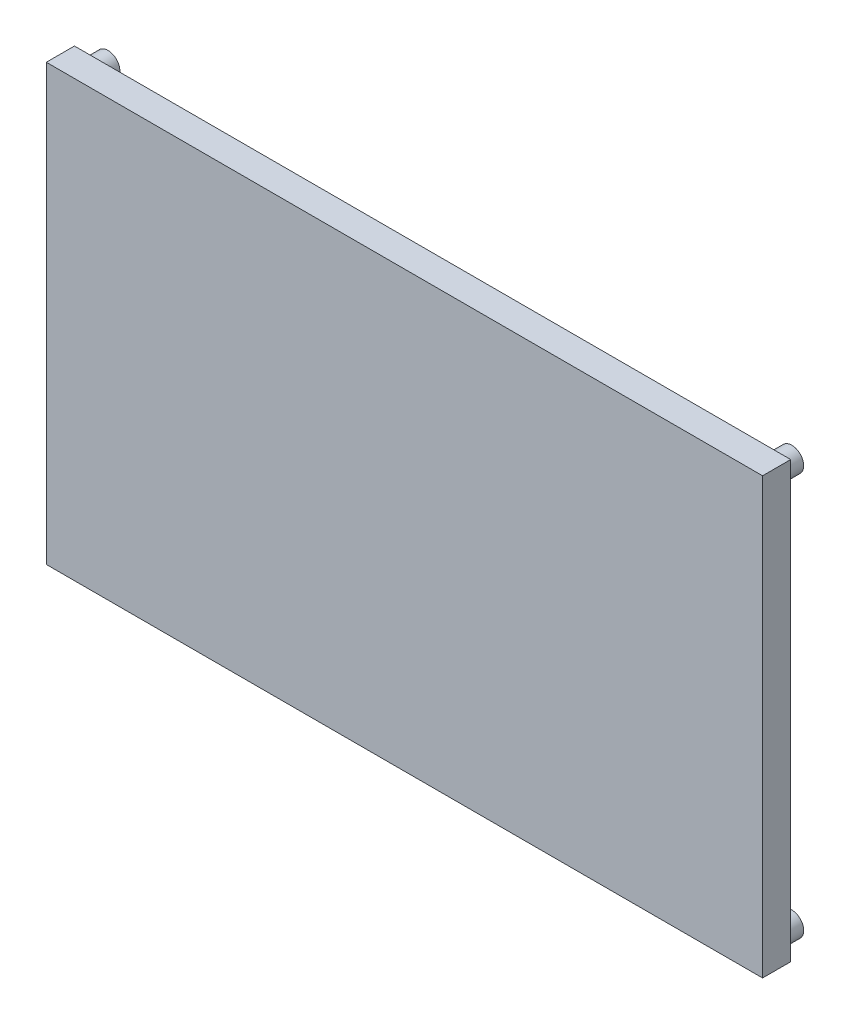
ISO-10303-21;
HEADER;
FILE_DESCRIPTION(('STEP AP214'),'2;1');
FILE_NAME('part.step','',(''),(''),'','','');
FILE_SCHEMA(('AUTOMOTIVE_DESIGN { 1 0 10303 214 1 1 1 1 }'));
ENDSEC;
DATA;
#1=APPLICATION_CONTEXT('core data for automotive mechanical design processes');
#2=APPLICATION_PROTOCOL_DEFINITION('international standard','automotive_design',2000,#1);
#3=PRODUCT_CONTEXT('',#1,'mechanical');
#4=PRODUCT('Part','Part','',(#3));
#5=PRODUCT_RELATED_PRODUCT_CATEGORY('part','',(#4));
#6=PRODUCT_DEFINITION_FORMATION('','',#4);
#7=PRODUCT_DEFINITION_CONTEXT('part definition',#1,'design');
#8=PRODUCT_DEFINITION('design','',#6,#7);
#9=PRODUCT_DEFINITION_SHAPE('','',#8);
#10=(LENGTH_UNIT() NAMED_UNIT(*) SI_UNIT(.MILLI.,.METRE.));
#11=(NAMED_UNIT(*) PLANE_ANGLE_UNIT() SI_UNIT($,.RADIAN.));
#12=(NAMED_UNIT(*) SI_UNIT($,.STERADIAN.) SOLID_ANGLE_UNIT());
#13=UNCERTAINTY_MEASURE_WITH_UNIT(LENGTH_MEASURE(1.E-05),#10,'distance_accuracy_value','');
#14=(GEOMETRIC_REPRESENTATION_CONTEXT(3) GLOBAL_UNCERTAINTY_ASSIGNED_CONTEXT((#13)) GLOBAL_UNIT_ASSIGNED_CONTEXT((#10,
#11,#12)) REPRESENTATION_CONTEXT('',''));
#15=CARTESIAN_POINT('',(0.,0.,0.));
#16=DIRECTION('',(0.,0.,1.));
#17=DIRECTION('',(1.,0.,0.));
#18=AXIS2_PLACEMENT_3D('',#15,#16,#17);
#19=CARTESIAN_POINT('',(82.75,-50.25,3.25));
#20=DIRECTION('',(-1.,0.,0.));
#21=DIRECTION('',(0.,-1.,0.));
#22=AXIS2_PLACEMENT_3D('',#19,#20,#21);
#23=PLANE('',#22);
#24=DIRECTION('',(0.,1.,0.));
#25=VECTOR('',#24,1.);
#26=CARTESIAN_POINT('',(82.75,-50.25,-3.25));
#27=LINE('',#26,#25);
#28=CARTESIAN_POINT('',(82.75,-50.25,-3.25));
#29=VERTEX_POINT('',#28);
#30=CARTESIAN_POINT('',(82.75,50.25,-3.25));
#31=VERTEX_POINT('',#30);
#32=EDGE_CURVE('E116',#29,#31,#27,.T.);
#33=ORIENTED_EDGE('',*,*,#32,.T.);
#34=DIRECTION('',(0.,0.,-1.));
#35=VECTOR('',#34,1.);
#36=CARTESIAN_POINT('',(82.75,50.25,3.25));
#37=LINE('',#36,#35);
#38=CARTESIAN_POINT('',(82.75,50.25,3.25));
#39=VERTEX_POINT('',#38);
#40=EDGE_CURVE('E105',#39,#31,#37,.T.);
#41=ORIENTED_EDGE('',*,*,#40,.F.);
#42=DIRECTION('',(0.,1.,0.));
#43=VECTOR('',#42,1.);
#44=CARTESIAN_POINT('',(82.75,-50.25,3.25));
#45=LINE('',#44,#43);
#46=CARTESIAN_POINT('',(82.75,-50.25,3.25));
#47=VERTEX_POINT('',#46);
#48=EDGE_CURVE('E97',#47,#39,#45,.T.);
#49=ORIENTED_EDGE('',*,*,#48,.F.);
#50=DIRECTION('',(0.,0.,-1.));
#51=VECTOR('',#50,1.);
#52=CARTESIAN_POINT('',(82.75,-50.25,3.25));
#53=LINE('',#52,#51);
#54=EDGE_CURVE('E112',#47,#29,#53,.T.);
#55=ORIENTED_EDGE('',*,*,#54,.T.);
#56=EDGE_LOOP('',(#33,#41,#49,#55));
#57=FACE_BOUND('',#56,.T.);
#58=ADVANCED_FACE('F44',(#57),#23,.F.);
#59=CARTESIAN_POINT('',(-82.75,50.25,3.25));
#60=DIRECTION('',(0.,-1.,0.));
#61=DIRECTION('',(0.,0.,-1.));
#62=AXIS2_PLACEMENT_3D('',#59,#60,#61);
#63=PLANE('',#62);
#64=DIRECTION('',(-1.,0.,0.));
#65=VECTOR('',#64,1.);
#66=CARTESIAN_POINT('',(-82.75,50.25,-3.25));
#67=LINE('',#66,#65);
#68=CARTESIAN_POINT('',(-82.75,50.25,-3.25));
#69=VERTEX_POINT('',#68);
#70=EDGE_CURVE('E103',#31,#69,#67,.T.);
#71=ORIENTED_EDGE('',*,*,#70,.T.);
#72=DIRECTION('',(0.,0.,-1.));
#73=VECTOR('',#72,1.);
#74=CARTESIAN_POINT('',(-82.75,50.25,3.25));
#75=LINE('',#74,#73);
#76=CARTESIAN_POINT('',(-82.75,50.25,3.25));
#77=VERTEX_POINT('',#76);
#78=EDGE_CURVE('E101',#77,#69,#75,.T.);
#79=ORIENTED_EDGE('',*,*,#78,.F.);
#80=DIRECTION('',(-1.,0.,0.));
#81=VECTOR('',#80,1.);
#82=CARTESIAN_POINT('',(-82.75,50.25,3.25));
#83=LINE('',#82,#81);
#84=EDGE_CURVE('E92',#39,#77,#83,.T.);
#85=ORIENTED_EDGE('',*,*,#84,.F.);
#86=ORIENTED_EDGE('',*,*,#40,.T.);
#87=EDGE_LOOP('',(#71,#79,#85,#86));
#88=FACE_BOUND('',#87,.T.);
#89=ADVANCED_FACE('F102',(#88),#63,.F.);
#90=CARTESIAN_POINT('',(-82.75,-50.25,3.25));
#91=DIRECTION('',(1.,0.,0.));
#92=DIRECTION('',(0.,0.,-1.));
#93=AXIS2_PLACEMENT_3D('',#90,#91,#92);
#94=PLANE('',#93);
#95=DIRECTION('',(0.,-1.,0.));
#96=VECTOR('',#95,1.);
#97=CARTESIAN_POINT('',(-82.75,-50.25,-3.25));
#98=LINE('',#97,#96);
#99=CARTESIAN_POINT('',(-82.75,-50.25,-3.25));
#100=VERTEX_POINT('',#99);
#101=EDGE_CURVE('E78',#69,#100,#98,.T.);
#102=ORIENTED_EDGE('',*,*,#101,.T.);
#103=DIRECTION('',(0.,0.,-1.));
#104=VECTOR('',#103,1.);
#105=CARTESIAN_POINT('',(-82.75,-50.25,3.25));
#106=LINE('',#105,#104);
#107=CARTESIAN_POINT('',(-82.75,-50.25,3.25));
#108=VERTEX_POINT('',#107);
#109=EDGE_CURVE('E106',#108,#100,#106,.T.);
#110=ORIENTED_EDGE('',*,*,#109,.F.);
#111=DIRECTION('',(0.,-1.,0.));
#112=VECTOR('',#111,1.);
#113=CARTESIAN_POINT('',(-82.75,-50.25,3.25));
#114=LINE('',#113,#112);
#115=EDGE_CURVE('E95',#77,#108,#114,.T.);
#116=ORIENTED_EDGE('',*,*,#115,.F.);
#117=ORIENTED_EDGE('',*,*,#78,.T.);
#118=EDGE_LOOP('',(#102,#110,#116,#117));
#119=FACE_BOUND('',#118,.T.);
#120=ADVANCED_FACE('F108',(#119),#94,.F.);
#121=CARTESIAN_POINT('',(-82.75,-50.25,3.25));
#122=DIRECTION('',(0.,1.,0.));
#123=DIRECTION('',(-1.,0.,0.));
#124=AXIS2_PLACEMENT_3D('',#121,#122,#123);
#125=PLANE('',#124);
#126=DIRECTION('',(1.,0.,0.));
#127=VECTOR('',#126,1.);
#128=CARTESIAN_POINT('',(-82.75,-50.25,-3.25));
#129=LINE('',#128,#127);
#130=EDGE_CURVE('E84',#100,#29,#129,.T.);
#131=ORIENTED_EDGE('',*,*,#130,.T.);
#132=ORIENTED_EDGE('',*,*,#54,.F.);
#133=DIRECTION('',(1.,0.,0.));
#134=VECTOR('',#133,1.);
#135=CARTESIAN_POINT('',(-82.75,-50.25,3.25));
#136=LINE('',#135,#134);
#137=EDGE_CURVE('E61',#108,#47,#136,.T.);
#138=ORIENTED_EDGE('',*,*,#137,.F.);
#139=ORIENTED_EDGE('',*,*,#109,.T.);
#140=EDGE_LOOP('',(#131,#132,#138,#139));
#141=FACE_BOUND('',#140,.T.);
#142=ADVANCED_FACE('F150',(#141),#125,.F.);
#143=CARTESIAN_POINT('',(0.,0.,3.25));
#144=DIRECTION('',(0.,0.,-1.));
#145=DIRECTION('',(-1.,0.,0.));
#146=AXIS2_PLACEMENT_3D('',#143,#144,#145);
#147=PLANE('',#146);
#148=ORIENTED_EDGE('',*,*,#48,.T.);
#149=ORIENTED_EDGE('',*,*,#84,.T.);
#150=ORIENTED_EDGE('',*,*,#115,.T.);
#151=ORIENTED_EDGE('',*,*,#137,.T.);
#152=EDGE_LOOP('',(#148,#149,#150,#151));
#153=FACE_BOUND('',#152,.T.);
#154=ADVANCED_FACE('F93',(#153),#147,.F.);
#155=CARTESIAN_POINT('',(0.,0.,-3.25));
#156=DIRECTION('',(0.,0.,-1.));
#157=DIRECTION('',(-1.,0.,0.));
#158=AXIS2_PLACEMENT_3D('',#155,#156,#157);
#159=PLANE('',#158);
#160=CARTESIAN_POINT('',(79.,-46.5,-3.25));
#161=DIRECTION('',(0.,0.,-1.));
#162=DIRECTION('',(1.,0.,0.));
#163=AXIS2_PLACEMENT_3D('',#160,#161,#162);
#164=CIRCLE('',#163,2.75000000000001);
#165=CARTESIAN_POINT('',(81.75,-46.5,-3.25));
#166=VERTEX_POINT('',#165);
#167=EDGE_CURVE('E273',#166,#166,#164,.T.);
#168=ORIENTED_EDGE('',*,*,#167,.F.);
#169=EDGE_LOOP('',(#168));
#170=FACE_BOUND('',#169,.T.);
#171=CARTESIAN_POINT('',(-79.,-46.5,-3.25));
#172=DIRECTION('',(0.,0.,-1.));
#173=DIRECTION('',(-1.,0.,0.));
#174=AXIS2_PLACEMENT_3D('',#171,#172,#173);
#175=CIRCLE('',#174,2.75000000000001);
#176=CARTESIAN_POINT('',(-81.75,-46.5,-3.25));
#177=VERTEX_POINT('',#176);
#178=EDGE_CURVE('E11',#177,#177,#175,.T.);
#179=ORIENTED_EDGE('',*,*,#178,.F.);
#180=EDGE_LOOP('',(#179));
#181=FACE_BOUND('',#180,.T.);
#182=CARTESIAN_POINT('',(79.,46.5,-3.25));
#183=DIRECTION('',(0.,0.,-1.));
#184=DIRECTION('',(-1.,0.,0.));
#185=AXIS2_PLACEMENT_3D('',#182,#183,#184);
#186=CIRCLE('',#185,2.75000000000001);
#187=CARTESIAN_POINT('',(76.25,46.5,-3.25));
#188=VERTEX_POINT('',#187);
#189=EDGE_CURVE('E53',#188,#188,#186,.T.);
#190=ORIENTED_EDGE('',*,*,#189,.F.);
#191=EDGE_LOOP('',(#190));
#192=FACE_BOUND('',#191,.T.);
#193=CARTESIAN_POINT('',(-79.,46.5,-3.25));
#194=DIRECTION('',(0.,0.,-1.));
#195=DIRECTION('',(-1.,0.,0.));
#196=AXIS2_PLACEMENT_3D('',#193,#194,#195);
#197=CIRCLE('',#196,2.75000000000001);
#198=CARTESIAN_POINT('',(-81.75,46.5,-3.25));
#199=VERTEX_POINT('',#198);
#200=EDGE_CURVE('E147',#199,#199,#197,.T.);
#201=ORIENTED_EDGE('',*,*,#200,.F.);
#202=EDGE_LOOP('',(#201));
#203=FACE_BOUND('',#202,.T.);
#204=ORIENTED_EDGE('',*,*,#32,.F.);
#205=ORIENTED_EDGE('',*,*,#130,.F.);
#206=ORIENTED_EDGE('',*,*,#101,.F.);
#207=ORIENTED_EDGE('',*,*,#70,.F.);
#208=EDGE_LOOP('',(#204,#205,#206,#207));
#209=FACE_BOUND('',#208,.T.);
#210=ADVANCED_FACE('F138',(#170,#181,#192,#203,#209),#159,.T.);
#211=CARTESIAN_POINT('',(-79.,46.5,-7.25));
#212=DIRECTION('',(0.,0.,1.));
#213=DIRECTION('',(1.,0.,0.));
#214=AXIS2_PLACEMENT_3D('',#211,#212,#213);
#215=CYLINDRICAL_SURFACE('',#214,2.75000000000001);
#216=CARTESIAN_POINT('',(-79.,46.5,-7.25));
#217=DIRECTION('',(0.,0.,-1.));
#218=DIRECTION('',(-1.,0.,0.));
#219=AXIS2_PLACEMENT_3D('',#216,#217,#218);
#220=CIRCLE('',#219,2.75000000000001);
#221=CARTESIAN_POINT('',(-81.75,46.5,-7.25));
#222=VERTEX_POINT('',#221);
#223=EDGE_CURVE('E120',#222,#222,#220,.T.);
#224=ORIENTED_EDGE('',*,*,#223,.F.);
#225=EDGE_LOOP('',(#224));
#226=FACE_BOUND('',#225,.T.);
#227=ORIENTED_EDGE('',*,*,#200,.T.);
#228=EDGE_LOOP('',(#227));
#229=FACE_BOUND('',#228,.T.);
#230=ADVANCED_FACE('F141',(#226,#229),#215,.T.);
#231=CARTESIAN_POINT('',(-79.,46.5,-7.25));
#232=DIRECTION('',(0.,0.,-1.));
#233=DIRECTION('',(-1.,0.,0.));
#234=AXIS2_PLACEMENT_3D('',#231,#232,#233);
#235=PLANE('',#234);
#236=ORIENTED_EDGE('',*,*,#223,.T.);
#237=EDGE_LOOP('',(#236));
#238=FACE_BOUND('',#237,.T.);
#239=ADVANCED_FACE('F198',(#238),#235,.T.);
#240=CARTESIAN_POINT('',(79.,46.5,-7.25));
#241=DIRECTION('',(0.,0.,1.));
#242=DIRECTION('',(1.,0.,0.));
#243=AXIS2_PLACEMENT_3D('',#240,#241,#242);
#244=CYLINDRICAL_SURFACE('',#243,2.75000000000001);
#245=CARTESIAN_POINT('',(79.,46.5,-7.25));
#246=DIRECTION('',(0.,0.,1.));
#247=DIRECTION('',(1.,0.,0.));
#248=AXIS2_PLACEMENT_3D('',#245,#246,#247);
#249=CIRCLE('',#248,2.75000000000001);
#250=CARTESIAN_POINT('',(81.75,46.5,-7.25));
#251=VERTEX_POINT('',#250);
#252=EDGE_CURVE('E278',#251,#251,#249,.T.);
#253=ORIENTED_EDGE('',*,*,#252,.T.);
#254=EDGE_LOOP('',(#253));
#255=FACE_BOUND('',#254,.T.);
#256=ORIENTED_EDGE('',*,*,#189,.T.);
#257=EDGE_LOOP('',(#256));
#258=FACE_BOUND('',#257,.T.);
#259=ADVANCED_FACE('F136',(#255,#258),#244,.T.);
#260=CARTESIAN_POINT('',(79.,46.5,-7.25));
#261=DIRECTION('',(0.,0.,-1.));
#262=DIRECTION('',(1.,0.,0.));
#263=AXIS2_PLACEMENT_3D('',#260,#261,#262);
#264=PLANE('',#263);
#265=ORIENTED_EDGE('',*,*,#252,.F.);
#266=EDGE_LOOP('',(#265));
#267=FACE_BOUND('',#266,.T.);
#268=ADVANCED_FACE('F215',(#267),#264,.T.);
#269=CARTESIAN_POINT('',(-79.,-46.5,-7.25));
#270=DIRECTION('',(0.,0.,1.));
#271=DIRECTION('',(1.,0.,0.));
#272=AXIS2_PLACEMENT_3D('',#269,#270,#271);
#273=CYLINDRICAL_SURFACE('',#272,2.75000000000001);
#274=CARTESIAN_POINT('',(-79.,-46.5,-7.25));
#275=DIRECTION('',(0.,0.,1.));
#276=DIRECTION('',(-1.,0.,0.));
#277=AXIS2_PLACEMENT_3D('',#274,#275,#276);
#278=CIRCLE('',#277,2.75000000000001);
#279=CARTESIAN_POINT('',(-81.75,-46.5,-7.25));
#280=VERTEX_POINT('',#279);
#281=EDGE_CURVE('E272',#280,#280,#278,.T.);
#282=ORIENTED_EDGE('',*,*,#281,.T.);
#283=EDGE_LOOP('',(#282));
#284=FACE_BOUND('',#283,.T.);
#285=ORIENTED_EDGE('',*,*,#178,.T.);
#286=EDGE_LOOP('',(#285));
#287=FACE_BOUND('',#286,.T.);
#288=ADVANCED_FACE('F225',(#284,#287),#273,.T.);
#289=CARTESIAN_POINT('',(-79.,-46.5,-7.25));
#290=DIRECTION('',(0.,0.,-1.));
#291=DIRECTION('',(-1.,0.,0.));
#292=AXIS2_PLACEMENT_3D('',#289,#290,#291);
#293=PLANE('',#292);
#294=ORIENTED_EDGE('',*,*,#281,.F.);
#295=EDGE_LOOP('',(#294));
#296=FACE_BOUND('',#295,.T.);
#297=ADVANCED_FACE('F235',(#296),#293,.T.);
#298=CARTESIAN_POINT('',(79.,-46.5,-7.25));
#299=DIRECTION('',(0.,0.,1.));
#300=DIRECTION('',(1.,0.,0.));
#301=AXIS2_PLACEMENT_3D('',#298,#299,#300);
#302=CYLINDRICAL_SURFACE('',#301,2.75000000000001);
#303=CARTESIAN_POINT('',(79.,-46.5,-7.25));
#304=DIRECTION('',(0.,0.,-1.));
#305=DIRECTION('',(1.,0.,0.));
#306=AXIS2_PLACEMENT_3D('',#303,#304,#305);
#307=CIRCLE('',#306,2.75000000000001);
#308=CARTESIAN_POINT('',(81.75,-46.5,-7.25));
#309=VERTEX_POINT('',#308);
#310=EDGE_CURVE('E270',#309,#309,#307,.T.);
#311=ORIENTED_EDGE('',*,*,#310,.F.);
#312=EDGE_LOOP('',(#311));
#313=FACE_BOUND('',#312,.T.);
#314=ORIENTED_EDGE('',*,*,#167,.T.);
#315=EDGE_LOOP('',(#314));
#316=FACE_BOUND('',#315,.T.);
#317=ADVANCED_FACE('F245',(#313,#316),#302,.T.);
#318=CARTESIAN_POINT('',(79.,-46.5,-7.25));
#319=DIRECTION('',(0.,0.,-1.));
#320=DIRECTION('',(1.,0.,0.));
#321=AXIS2_PLACEMENT_3D('',#318,#319,#320);
#322=PLANE('',#321);
#323=ORIENTED_EDGE('',*,*,#310,.T.);
#324=EDGE_LOOP('',(#323));
#325=FACE_BOUND('',#324,.T.);
#326=ADVANCED_FACE('F255',(#325),#322,.T.);
#327=CLOSED_SHELL('',(#58,#89,#120,#142,#154,#210,#230,#239,#259,#268,#288,#297,#317,#326));
#328=MANIFOLD_SOLID_BREP('B2',#327);
#329=ADVANCED_BREP_SHAPE_REPRESENTATION('',(#18,#328),#14);
#330=SHAPE_DEFINITION_REPRESENTATION(#9,#329);
ENDSEC;
END-ISO-10303-21;
